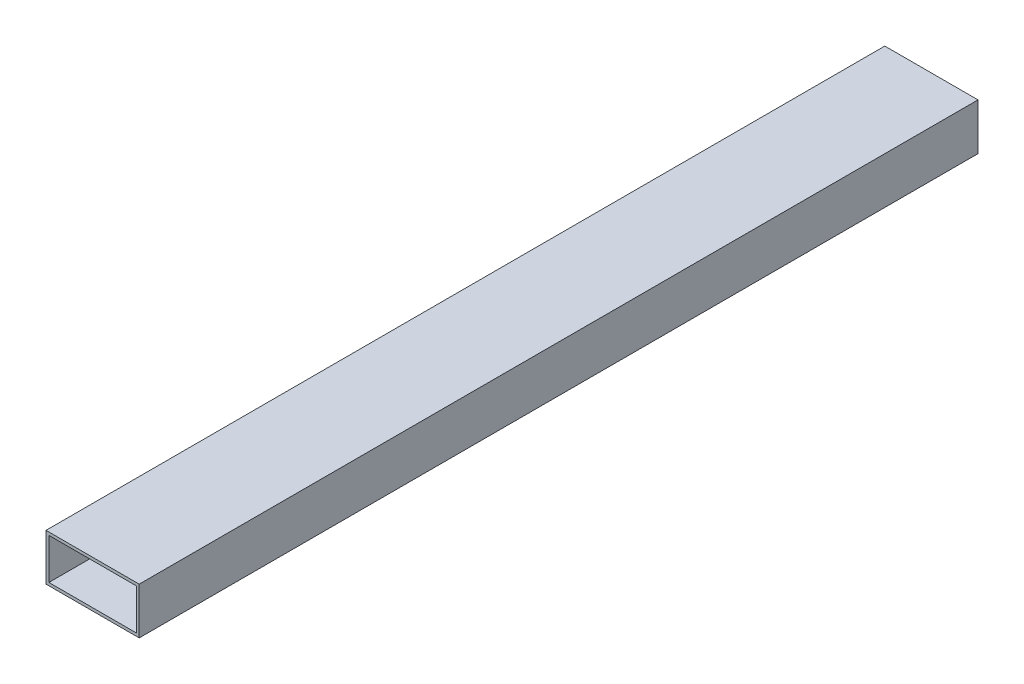
ISO-10303-21;
HEADER;
FILE_DESCRIPTION(('STEP AP214'),'2;1');
FILE_NAME('part.step','',(''),(''),'','','');
FILE_SCHEMA(('AUTOMOTIVE_DESIGN { 1 0 10303 214 1 1 1 1 }'));
ENDSEC;
DATA;
#1=APPLICATION_CONTEXT('core data for automotive mechanical design processes');
#2=APPLICATION_PROTOCOL_DEFINITION('international standard','automotive_design',2000,#1);
#3=PRODUCT_CONTEXT('',#1,'mechanical');
#4=PRODUCT('Part','Part','',(#3));
#5=PRODUCT_RELATED_PRODUCT_CATEGORY('part','',(#4));
#6=PRODUCT_DEFINITION_FORMATION('','',#4);
#7=PRODUCT_DEFINITION_CONTEXT('part definition',#1,'design');
#8=PRODUCT_DEFINITION('design','',#6,#7);
#9=PRODUCT_DEFINITION_SHAPE('','',#8);
#10=(LENGTH_UNIT() NAMED_UNIT(*) SI_UNIT(.MILLI.,.METRE.));
#11=(NAMED_UNIT(*) PLANE_ANGLE_UNIT() SI_UNIT($,.RADIAN.));
#12=(NAMED_UNIT(*) SI_UNIT($,.STERADIAN.) SOLID_ANGLE_UNIT());
#13=UNCERTAINTY_MEASURE_WITH_UNIT(LENGTH_MEASURE(1.E-05),#10,'distance_accuracy_value','');
#14=(GEOMETRIC_REPRESENTATION_CONTEXT(3) GLOBAL_UNCERTAINTY_ASSIGNED_CONTEXT((#13)) GLOBAL_UNIT_ASSIGNED_CONTEXT((#10,
#11,#12)) REPRESENTATION_CONTEXT('',''));
#15=CARTESIAN_POINT('',(0.,0.,0.));
#16=DIRECTION('',(0.,0.,1.));
#17=DIRECTION('',(1.,0.,0.));
#18=AXIS2_PLACEMENT_3D('',#15,#16,#17);
#19=CARTESIAN_POINT('',(0.,0.,457.2));
#20=DIRECTION('',(0.,0.,-1.));
#21=DIRECTION('',(-1.,0.,0.));
#22=AXIS2_PLACEMENT_3D('',#19,#20,#21);
#23=PLANE('',#22);
#24=DIRECTION('',(0.,-1.,0.));
#25=VECTOR('',#24,1.);
#26=CARTESIAN_POINT('',(0.,0.,457.2));
#27=LINE('',#26,#25);
#28=CARTESIAN_POINT('',(0.,25.4,457.2));
#29=VERTEX_POINT('',#28);
#30=CARTESIAN_POINT('',(0.,0.,457.2));
#31=VERTEX_POINT('',#30);
#32=EDGE_CURVE('E134',#29,#31,#27,.T.);
#33=ORIENTED_EDGE('',*,*,#32,.T.);
#34=DIRECTION('',(1.,0.,0.));
#35=VECTOR('',#34,1.);
#36=CARTESIAN_POINT('',(0.,0.,457.2));
#37=LINE('',#36,#35);
#38=CARTESIAN_POINT('',(50.8,0.,457.2));
#39=VERTEX_POINT('',#38);
#40=EDGE_CURVE('E137',#31,#39,#37,.T.);
#41=ORIENTED_EDGE('',*,*,#40,.T.);
#42=DIRECTION('',(0.,1.,0.));
#43=VECTOR('',#42,1.);
#44=CARTESIAN_POINT('',(50.8,0.,457.2));
#45=LINE('',#44,#43);
#46=CARTESIAN_POINT('',(50.8,25.4,457.2));
#47=VERTEX_POINT('',#46);
#48=EDGE_CURVE('E140',#39,#47,#45,.T.);
#49=ORIENTED_EDGE('',*,*,#48,.T.);
#50=DIRECTION('',(-1.,0.,0.));
#51=VECTOR('',#50,1.);
#52=CARTESIAN_POINT('',(0.,25.4,457.2));
#53=LINE('',#52,#51);
#54=EDGE_CURVE('E142',#47,#29,#53,.T.);
#55=ORIENTED_EDGE('',*,*,#54,.T.);
#56=EDGE_LOOP('',(#33,#41,#49,#55));
#57=FACE_BOUND('',#56,.T.);
#58=DIRECTION('',(0.,-1.,0.));
#59=VECTOR('',#58,1.);
#60=CARTESIAN_POINT('',(1.5875,1.5875,457.2));
#61=LINE('',#60,#59);
#62=CARTESIAN_POINT('',(1.5875,23.8125,457.2));
#63=VERTEX_POINT('',#62);
#64=CARTESIAN_POINT('',(1.5875,1.5875,457.2));
#65=VERTEX_POINT('',#64);
#66=EDGE_CURVE('E98',#63,#65,#61,.T.);
#67=ORIENTED_EDGE('',*,*,#66,.F.);
#68=DIRECTION('',(-1.,0.,0.));
#69=VECTOR('',#68,1.);
#70=CARTESIAN_POINT('',(1.5875,23.8125,457.2));
#71=LINE('',#70,#69);
#72=CARTESIAN_POINT('',(49.2125,23.8125,457.2));
#73=VERTEX_POINT('',#72);
#74=EDGE_CURVE('E120',#73,#63,#71,.T.);
#75=ORIENTED_EDGE('',*,*,#74,.F.);
#76=DIRECTION('',(0.,1.,0.));
#77=VECTOR('',#76,1.);
#78=CARTESIAN_POINT('',(49.2125,1.5875,457.2));
#79=LINE('',#78,#77);
#80=CARTESIAN_POINT('',(49.2125,1.5875,457.2));
#81=VERTEX_POINT('',#80);
#82=EDGE_CURVE('E118',#81,#73,#79,.T.);
#83=ORIENTED_EDGE('',*,*,#82,.F.);
#84=DIRECTION('',(1.,0.,0.));
#85=VECTOR('',#84,1.);
#86=CARTESIAN_POINT('',(1.5875,1.5875,457.2));
#87=LINE('',#86,#85);
#88=EDGE_CURVE('E106',#65,#81,#87,.T.);
#89=ORIENTED_EDGE('',*,*,#88,.F.);
#90=EDGE_LOOP('',(#67,#75,#83,#89));
#91=FACE_BOUND('',#90,.T.);
#92=ADVANCED_FACE('F33',(#57,#91),#23,.F.);
#93=CARTESIAN_POINT('',(0.,0.,0.));
#94=DIRECTION('',(0.,0.,-1.));
#95=DIRECTION('',(-1.,0.,0.));
#96=AXIS2_PLACEMENT_3D('',#93,#94,#95);
#97=PLANE('',#96);
#98=DIRECTION('',(0.,-1.,0.));
#99=VECTOR('',#98,1.);
#100=CARTESIAN_POINT('',(0.,0.,0.));
#101=LINE('',#100,#99);
#102=CARTESIAN_POINT('',(0.,25.4,0.));
#103=VERTEX_POINT('',#102);
#104=CARTESIAN_POINT('',(0.,0.,0.));
#105=VERTEX_POINT('',#104);
#106=EDGE_CURVE('E114',#103,#105,#101,.T.);
#107=ORIENTED_EDGE('',*,*,#106,.F.);
#108=DIRECTION('',(-1.,0.,0.));
#109=VECTOR('',#108,1.);
#110=CARTESIAN_POINT('',(0.,25.4,0.));
#111=LINE('',#110,#109);
#112=CARTESIAN_POINT('',(50.8,25.4,0.));
#113=VERTEX_POINT('',#112);
#114=EDGE_CURVE('E138',#113,#103,#111,.T.);
#115=ORIENTED_EDGE('',*,*,#114,.F.);
#116=DIRECTION('',(0.,1.,0.));
#117=VECTOR('',#116,1.);
#118=CARTESIAN_POINT('',(50.8,0.,0.));
#119=LINE('',#118,#117);
#120=CARTESIAN_POINT('',(50.8,0.,0.));
#121=VERTEX_POINT('',#120);
#122=EDGE_CURVE('E149',#121,#113,#119,.T.);
#123=ORIENTED_EDGE('',*,*,#122,.F.);
#124=DIRECTION('',(1.,0.,0.));
#125=VECTOR('',#124,1.);
#126=CARTESIAN_POINT('',(0.,0.,0.));
#127=LINE('',#126,#125);
#128=EDGE_CURVE('E147',#105,#121,#127,.T.);
#129=ORIENTED_EDGE('',*,*,#128,.F.);
#130=EDGE_LOOP('',(#107,#115,#123,#129));
#131=FACE_BOUND('',#130,.T.);
#132=DIRECTION('',(-1.,0.,0.));
#133=VECTOR('',#132,1.);
#134=CARTESIAN_POINT('',(1.5875,23.8125,0.));
#135=LINE('',#134,#133);
#136=CARTESIAN_POINT('',(49.2125,23.8125,0.));
#137=VERTEX_POINT('',#136);
#138=CARTESIAN_POINT('',(1.5875,23.8125,0.));
#139=VERTEX_POINT('',#138);
#140=EDGE_CURVE('E107',#137,#139,#135,.T.);
#141=ORIENTED_EDGE('',*,*,#140,.T.);
#142=DIRECTION('',(0.,-1.,0.));
#143=VECTOR('',#142,1.);
#144=CARTESIAN_POINT('',(1.5875,1.5875,0.));
#145=LINE('',#144,#143);
#146=CARTESIAN_POINT('',(1.5875,1.5875,0.));
#147=VERTEX_POINT('',#146);
#148=EDGE_CURVE('E56',#139,#147,#145,.T.);
#149=ORIENTED_EDGE('',*,*,#148,.T.);
#150=DIRECTION('',(1.,0.,0.));
#151=VECTOR('',#150,1.);
#152=CARTESIAN_POINT('',(1.5875,1.5875,0.));
#153=LINE('',#152,#151);
#154=CARTESIAN_POINT('',(49.2125,1.5875,0.));
#155=VERTEX_POINT('',#154);
#156=EDGE_CURVE('E113',#147,#155,#153,.T.);
#157=ORIENTED_EDGE('',*,*,#156,.T.);
#158=DIRECTION('',(0.,1.,0.));
#159=VECTOR('',#158,1.);
#160=CARTESIAN_POINT('',(49.2125,1.5875,0.));
#161=LINE('',#160,#159);
#162=EDGE_CURVE('E126',#155,#137,#161,.T.);
#163=ORIENTED_EDGE('',*,*,#162,.T.);
#164=EDGE_LOOP('',(#141,#149,#157,#163));
#165=FACE_BOUND('',#164,.T.);
#166=ADVANCED_FACE('F167',(#131,#165),#97,.T.);
#167=CARTESIAN_POINT('',(0.,0.,457.2));
#168=DIRECTION('',(1.,0.,0.));
#169=DIRECTION('',(0.,0.,-1.));
#170=AXIS2_PLACEMENT_3D('',#167,#168,#169);
#171=PLANE('',#170);
#172=ORIENTED_EDGE('',*,*,#106,.T.);
#173=DIRECTION('',(0.,0.,-1.));
#174=VECTOR('',#173,1.);
#175=CARTESIAN_POINT('',(0.,0.,457.2));
#176=LINE('',#175,#174);
#177=EDGE_CURVE('E11',#31,#105,#176,.T.);
#178=ORIENTED_EDGE('',*,*,#177,.F.);
#179=ORIENTED_EDGE('',*,*,#32,.F.);
#180=DIRECTION('',(0.,0.,-1.));
#181=VECTOR('',#180,1.);
#182=CARTESIAN_POINT('',(0.,25.4,457.2));
#183=LINE('',#182,#181);
#184=EDGE_CURVE('E144',#29,#103,#183,.T.);
#185=ORIENTED_EDGE('',*,*,#184,.T.);
#186=EDGE_LOOP('',(#172,#178,#179,#185));
#187=FACE_BOUND('',#186,.T.);
#188=ADVANCED_FACE('F35',(#187),#171,.F.);
#189=CARTESIAN_POINT('',(0.,0.,457.2));
#190=DIRECTION('',(0.,1.,0.));
#191=DIRECTION('',(0.,0.,1.));
#192=AXIS2_PLACEMENT_3D('',#189,#190,#191);
#193=PLANE('',#192);
#194=ORIENTED_EDGE('',*,*,#128,.T.);
#195=DIRECTION('',(0.,0.,-1.));
#196=VECTOR('',#195,1.);
#197=CARTESIAN_POINT('',(50.8,0.,457.2));
#198=LINE('',#197,#196);
#199=EDGE_CURVE('E41',#39,#121,#198,.T.);
#200=ORIENTED_EDGE('',*,*,#199,.F.);
#201=ORIENTED_EDGE('',*,*,#40,.F.);
#202=ORIENTED_EDGE('',*,*,#177,.T.);
#203=EDGE_LOOP('',(#194,#200,#201,#202));
#204=FACE_BOUND('',#203,.T.);
#205=ADVANCED_FACE('F177',(#204),#193,.F.);
#206=CARTESIAN_POINT('',(50.8,0.,457.2));
#207=DIRECTION('',(-1.,0.,0.));
#208=DIRECTION('',(0.,0.,1.));
#209=AXIS2_PLACEMENT_3D('',#206,#207,#208);
#210=PLANE('',#209);
#211=ORIENTED_EDGE('',*,*,#122,.T.);
#212=DIRECTION('',(0.,0.,-1.));
#213=VECTOR('',#212,1.);
#214=CARTESIAN_POINT('',(50.8,25.4,457.2));
#215=LINE('',#214,#213);
#216=EDGE_CURVE('E154',#47,#113,#215,.T.);
#217=ORIENTED_EDGE('',*,*,#216,.F.);
#218=ORIENTED_EDGE('',*,*,#48,.F.);
#219=ORIENTED_EDGE('',*,*,#199,.T.);
#220=EDGE_LOOP('',(#211,#217,#218,#219));
#221=FACE_BOUND('',#220,.T.);
#222=ADVANCED_FACE('F161',(#221),#210,.F.);
#223=CARTESIAN_POINT('',(0.,25.4,457.2));
#224=DIRECTION('',(0.,-1.,0.));
#225=DIRECTION('',(0.,0.,-1.));
#226=AXIS2_PLACEMENT_3D('',#223,#224,#225);
#227=PLANE('',#226);
#228=ORIENTED_EDGE('',*,*,#114,.T.);
#229=ORIENTED_EDGE('',*,*,#184,.F.);
#230=ORIENTED_EDGE('',*,*,#54,.F.);
#231=ORIENTED_EDGE('',*,*,#216,.T.);
#232=EDGE_LOOP('',(#228,#229,#230,#231));
#233=FACE_BOUND('',#232,.T.);
#234=ADVANCED_FACE('F171',(#233),#227,.F.);
#235=CARTESIAN_POINT('',(1.5875,1.5875,457.2));
#236=DIRECTION('',(1.,0.,0.));
#237=DIRECTION('',(0.,0.,-1.));
#238=AXIS2_PLACEMENT_3D('',#235,#236,#237);
#239=PLANE('',#238);
#240=ORIENTED_EDGE('',*,*,#148,.F.);
#241=DIRECTION('',(0.,0.,-1.));
#242=VECTOR('',#241,1.);
#243=CARTESIAN_POINT('',(1.5875,23.8125,457.2));
#244=LINE('',#243,#242);
#245=EDGE_CURVE('E102',#63,#139,#244,.T.);
#246=ORIENTED_EDGE('',*,*,#245,.F.);
#247=ORIENTED_EDGE('',*,*,#66,.T.);
#248=DIRECTION('',(0.,0.,-1.));
#249=VECTOR('',#248,1.);
#250=CARTESIAN_POINT('',(1.5875,1.5875,457.2));
#251=LINE('',#250,#249);
#252=EDGE_CURVE('E101',#65,#147,#251,.T.);
#253=ORIENTED_EDGE('',*,*,#252,.T.);
#254=EDGE_LOOP('',(#240,#246,#247,#253));
#255=FACE_BOUND('',#254,.T.);
#256=ADVANCED_FACE('F100',(#255),#239,.T.);
#257=CARTESIAN_POINT('',(1.5875,1.5875,457.2));
#258=DIRECTION('',(0.,1.,0.));
#259=DIRECTION('',(0.,0.,1.));
#260=AXIS2_PLACEMENT_3D('',#257,#258,#259);
#261=PLANE('',#260);
#262=ORIENTED_EDGE('',*,*,#156,.F.);
#263=ORIENTED_EDGE('',*,*,#252,.F.);
#264=ORIENTED_EDGE('',*,*,#88,.T.);
#265=DIRECTION('',(0.,0.,-1.));
#266=VECTOR('',#265,1.);
#267=CARTESIAN_POINT('',(49.2125,1.5875,457.2));
#268=LINE('',#267,#266);
#269=EDGE_CURVE('E115',#81,#155,#268,.T.);
#270=ORIENTED_EDGE('',*,*,#269,.T.);
#271=EDGE_LOOP('',(#262,#263,#264,#270));
#272=FACE_BOUND('',#271,.T.);
#273=ADVANCED_FACE('F110',(#272),#261,.T.);
#274=CARTESIAN_POINT('',(49.2125,1.5875,457.2));
#275=DIRECTION('',(-1.,0.,0.));
#276=DIRECTION('',(0.,0.,1.));
#277=AXIS2_PLACEMENT_3D('',#274,#275,#276);
#278=PLANE('',#277);
#279=ORIENTED_EDGE('',*,*,#162,.F.);
#280=ORIENTED_EDGE('',*,*,#269,.F.);
#281=ORIENTED_EDGE('',*,*,#82,.T.);
#282=DIRECTION('',(0.,0.,-1.));
#283=VECTOR('',#282,1.);
#284=CARTESIAN_POINT('',(49.2125,23.8125,457.2));
#285=LINE('',#284,#283);
#286=EDGE_CURVE('E48',#73,#137,#285,.T.);
#287=ORIENTED_EDGE('',*,*,#286,.T.);
#288=EDGE_LOOP('',(#279,#280,#281,#287));
#289=FACE_BOUND('',#288,.T.);
#290=ADVANCED_FACE('F200',(#289),#278,.T.);
#291=CARTESIAN_POINT('',(1.5875,23.8125,457.2));
#292=DIRECTION('',(0.,-1.,0.));
#293=DIRECTION('',(0.,0.,-1.));
#294=AXIS2_PLACEMENT_3D('',#291,#292,#293);
#295=PLANE('',#294);
#296=ORIENTED_EDGE('',*,*,#140,.F.);
#297=ORIENTED_EDGE('',*,*,#286,.F.);
#298=ORIENTED_EDGE('',*,*,#74,.T.);
#299=ORIENTED_EDGE('',*,*,#245,.T.);
#300=EDGE_LOOP('',(#296,#297,#298,#299));
#301=FACE_BOUND('',#300,.T.);
#302=ADVANCED_FACE('F204',(#301),#295,.T.);
#303=CLOSED_SHELL('',(#92,#166,#188,#205,#222,#234,#256,#273,#290,#302));
#304=MANIFOLD_SOLID_BREP('B2',#303);
#305=ADVANCED_BREP_SHAPE_REPRESENTATION('',(#18,#304),#14);
#306=SHAPE_DEFINITION_REPRESENTATION(#9,#305);
ENDSEC;
END-ISO-10303-21;
